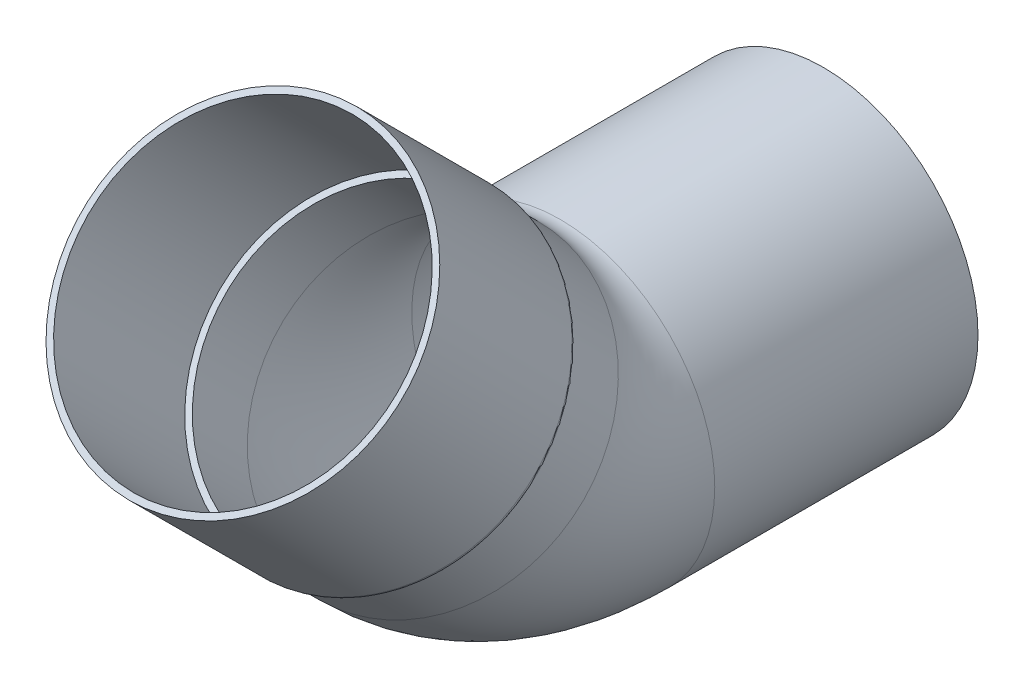
ISO-10303-21;
HEADER;
FILE_DESCRIPTION(('STEP AP214'),'2;1');
FILE_NAME('part.step','',(''),(''),'','','');
FILE_SCHEMA(('AUTOMOTIVE_DESIGN { 1 0 10303 214 1 1 1 1 }'));
ENDSEC;
DATA;
#1=APPLICATION_CONTEXT('core data for automotive mechanical design processes');
#2=APPLICATION_PROTOCOL_DEFINITION('international standard','automotive_design',2000,#1);
#3=PRODUCT_CONTEXT('',#1,'mechanical');
#4=PRODUCT('Part','Part','',(#3));
#5=PRODUCT_RELATED_PRODUCT_CATEGORY('part','',(#4));
#6=PRODUCT_DEFINITION_FORMATION('','',#4);
#7=PRODUCT_DEFINITION_CONTEXT('part definition',#1,'design');
#8=PRODUCT_DEFINITION('design','',#6,#7);
#9=PRODUCT_DEFINITION_SHAPE('','',#8);
#10=(LENGTH_UNIT() NAMED_UNIT(*) SI_UNIT(.MILLI.,.METRE.));
#11=(NAMED_UNIT(*) PLANE_ANGLE_UNIT() SI_UNIT($,.RADIAN.));
#12=(NAMED_UNIT(*) SI_UNIT($,.STERADIAN.) SOLID_ANGLE_UNIT());
#13=UNCERTAINTY_MEASURE_WITH_UNIT(LENGTH_MEASURE(1.E-05),#10,'distance_accuracy_value','');
#14=(GEOMETRIC_REPRESENTATION_CONTEXT(3) GLOBAL_UNCERTAINTY_ASSIGNED_CONTEXT((#13)) GLOBAL_UNIT_ASSIGNED_CONTEXT((#10,
#11,#12)) REPRESENTATION_CONTEXT('',''));
#15=CARTESIAN_POINT('',(0.,0.,0.));
#16=DIRECTION('',(0.,0.,1.));
#17=DIRECTION('',(1.,0.,0.));
#18=AXIS2_PLACEMENT_3D('',#15,#16,#17);
#19=CARTESIAN_POINT('',(0.,8.78679656440358,63.7867965644036));
#20=DIRECTION('',(0.,0.707106781186549,0.707106781186547));
#21=DIRECTION('',(0.,-0.707106781186547,0.707106781186549));
#22=AXIS2_PLACEMENT_3D('',#19,#20,#21);
#23=CYLINDRICAL_SURFACE('',#22,25.);
#24=CARTESIAN_POINT('',(0.,16.2634559672906,71.2634559672906));
#25=DIRECTION('',(0.,0.707106781186549,0.707106781186546));
#26=DIRECTION('',(0.,-0.707106781186546,0.707106781186549));
#27=AXIS2_PLACEMENT_3D('',#24,#25,#26);
#28=CIRCLE('',#27,25.);
#29=CARTESIAN_POINT('',(0.,-1.41421356237303,88.9411254969543));
#30=VERTEX_POINT('',#29);
#31=EDGE_CURVE('E54',#30,#30,#28,.F.);
#32=ORIENTED_EDGE('',*,*,#31,.T.);
#33=EDGE_LOOP('',(#32));
#34=FACE_BOUND('',#33,.T.);
#35=CARTESIAN_POINT('',(0.,8.78679656440358,63.7867965644036));
#36=DIRECTION('',(0.,0.707106781186548,0.707106781186547));
#37=DIRECTION('',(1.,0.,0.));
#38=AXIS2_PLACEMENT_3D('',#35,#36,#37);
#39=CIRCLE('',#38,25.);
#40=CARTESIAN_POINT('',(0.,-8.8908729652601,81.4644660940672));
#41=VERTEX_POINT('',#40);
#42=EDGE_CURVE('E63',#41,#41,#39,.T.);
#43=ORIENTED_EDGE('',*,*,#42,.T.);
#44=EDGE_LOOP('',(#43));
#45=FACE_BOUND('',#44,.T.);
#46=ADVANCED_FACE('F43',(#34,#45),#23,.T.);
#47=CARTESIAN_POINT('',(0.,30.,42.5735931288071));
#48=DIRECTION('',(-1.,0.,0.));
#49=DIRECTION('',(0.,0.,1.));
#50=AXIS2_PLACEMENT_3D('',#47,#48,#49);
#51=TOROIDAL_SURFACE('',#50,30.,25.);
#52=CARTESIAN_POINT('',(0.,0.,42.5735931288071));
#53=DIRECTION('',(0.,0.,1.));
#54=DIRECTION('',(1.,0.,0.));
#55=AXIS2_PLACEMENT_3D('',#52,#53,#54);
#56=CIRCLE('',#55,25.);
#57=CARTESIAN_POINT('',(0.,-25.,42.5735931288071));
#58=VERTEX_POINT('',#57);
#59=EDGE_CURVE('E66',#58,#58,#56,.T.);
#60=CARTESIAN_POINT('',(0.,30.,42.5735931288071));
#61=DIRECTION('',(-1.,0.,0.));
#62=DIRECTION('',(0.,0.,1.));
#63=AXIS2_PLACEMENT_3D('',#60,#61,#62);
#64=CIRCLE('',#63,55.);
#65=EDGE_CURVE('',#58,#41,#64,.T.);
#66=ORIENTED_EDGE('',*,*,#59,.T.);
#67=ORIENTED_EDGE('',*,*,#42,.F.);
#68=ORIENTED_EDGE('',*,*,#65,.T.);
#69=ORIENTED_EDGE('',*,*,#65,.F.);
#70=EDGE_LOOP('',(#66,#68,#67,#69));
#71=FACE_BOUND('',#70,.T.);
#72=ADVANCED_FACE('F109',(#71),#51,.T.);
#73=CARTESIAN_POINT('',(0.,0.,42.5735931288071));
#74=DIRECTION('',(0.,0.,-1.));
#75=DIRECTION('',(0.,1.,0.));
#76=AXIS2_PLACEMENT_3D('',#73,#74,#75);
#77=CYLINDRICAL_SURFACE('',#76,25.);
#78=ORIENTED_EDGE('',*,*,#59,.F.);
#79=EDGE_LOOP('',(#78));
#80=FACE_BOUND('',#79,.T.);
#81=CARTESIAN_POINT('',(0.,0.,0.));
#82=DIRECTION('',(0.,0.,1.));
#83=DIRECTION('',(1.,0.,0.));
#84=AXIS2_PLACEMENT_3D('',#81,#82,#83);
#85=CIRCLE('',#84,25.);
#86=CARTESIAN_POINT('',(25.,0.,0.));
#87=VERTEX_POINT('',#86);
#88=EDGE_CURVE('E67',#87,#87,#85,.T.);
#89=ORIENTED_EDGE('',*,*,#88,.T.);
#90=EDGE_LOOP('',(#89));
#91=FACE_BOUND('',#90,.T.);
#92=ADVANCED_FACE('F115',(#80,#91),#77,.T.);
#93=CARTESIAN_POINT('',(0.,0.,0.));
#94=DIRECTION('',(0.,0.,1.));
#95=DIRECTION('',(1.,0.,0.));
#96=AXIS2_PLACEMENT_3D('',#93,#94,#95);
#97=PLANE('',#96);
#98=CARTESIAN_POINT('',(0.,0.,0.));
#99=DIRECTION('',(0.,0.,1.));
#100=DIRECTION('',(1.,0.,0.));
#101=AXIS2_PLACEMENT_3D('',#98,#99,#100);
#102=CIRCLE('',#101,24.);
#103=CARTESIAN_POINT('',(24.,0.,0.));
#104=VERTEX_POINT('',#103);
#105=EDGE_CURVE('E73',#104,#104,#102,.T.);
#106=ORIENTED_EDGE('',*,*,#105,.T.);
#107=EDGE_LOOP('',(#106));
#108=FACE_BOUND('',#107,.T.);
#109=ORIENTED_EDGE('',*,*,#88,.F.);
#110=EDGE_LOOP('',(#109));
#111=FACE_BOUND('',#110,.T.);
#112=ADVANCED_FACE('F178',(#108,#111),#97,.F.);
#113=CARTESIAN_POINT('',(0.,8.78679656440358,63.7867965644036));
#114=DIRECTION('',(0.,0.707106781186549,0.707106781186547));
#115=DIRECTION('',(0.,-0.707106781186547,0.707106781186549));
#116=AXIS2_PLACEMENT_3D('',#113,#114,#115);
#117=CYLINDRICAL_SURFACE('',#116,24.);
#118=CARTESIAN_POINT('',(0.,8.78679656440358,63.7867965644036));
#119=DIRECTION('',(0.,0.707106781186549,0.707106781186547));
#120=DIRECTION('',(0.,-0.707106781186547,0.707106781186549));
#121=AXIS2_PLACEMENT_3D('',#118,#119,#120);
#122=CIRCLE('',#121,24.);
#123=CARTESIAN_POINT('',(0.,-8.18376618407354,80.7573593128807));
#124=VERTEX_POINT('',#123);
#125=EDGE_CURVE('E70',#124,#124,#122,.T.);
#126=ORIENTED_EDGE('',*,*,#125,.F.);
#127=EDGE_LOOP('',(#126));
#128=FACE_BOUND('',#127,.T.);
#129=CARTESIAN_POINT('',(0.,17.6776695296637,72.6776695296637));
#130=DIRECTION('',(0.,0.707106781186549,0.707106781186546));
#131=DIRECTION('',(0.,-0.707106781186546,0.707106781186549));
#132=AXIS2_PLACEMENT_3D('',#129,#130,#131);
#133=CIRCLE('',#132,24.);
#134=CARTESIAN_POINT('',(0.,0.707106781186614,89.6482322781408));
#135=VERTEX_POINT('',#134);
#136=EDGE_CURVE('E77',#135,#135,#133,.T.);
#137=ORIENTED_EDGE('',*,*,#136,.T.);
#138=EDGE_LOOP('',(#137));
#139=FACE_BOUND('',#138,.T.);
#140=ADVANCED_FACE('F173',(#128,#139),#117,.F.);
#141=CARTESIAN_POINT('',(0.,30.,42.5735931288071));
#142=DIRECTION('',(-1.,0.,0.));
#143=DIRECTION('',(0.,0.,1.));
#144=AXIS2_PLACEMENT_3D('',#141,#142,#143);
#145=TOROIDAL_SURFACE('',#144,30.,24.);
#146=CARTESIAN_POINT('',(0.,0.,42.5735931288071));
#147=DIRECTION('',(0.,0.,-1.));
#148=DIRECTION('',(0.,1.,0.));
#149=AXIS2_PLACEMENT_3D('',#146,#147,#148);
#150=CIRCLE('',#149,24.);
#151=CARTESIAN_POINT('',(0.,-24.,42.5735931288071));
#152=VERTEX_POINT('',#151);
#153=EDGE_CURVE('E76',#152,#152,#150,.F.);
#154=CARTESIAN_POINT('',(0.,30.,42.5735931288071));
#155=DIRECTION('',(-1.,0.,0.));
#156=DIRECTION('',(0.,0.,1.));
#157=AXIS2_PLACEMENT_3D('',#154,#155,#156);
#158=CIRCLE('',#157,54.);
#159=EDGE_CURVE('',#152,#124,#158,.T.);
#160=ORIENTED_EDGE('',*,*,#153,.F.);
#161=ORIENTED_EDGE('',*,*,#125,.T.);
#162=ORIENTED_EDGE('',*,*,#159,.T.);
#163=ORIENTED_EDGE('',*,*,#159,.F.);
#164=EDGE_LOOP('',(#160,#162,#161,#163));
#165=FACE_BOUND('',#164,.T.);
#166=ADVANCED_FACE('F177',(#165),#145,.F.);
#167=CARTESIAN_POINT('',(0.,0.,42.5735931288071));
#168=DIRECTION('',(0.,0.,-1.));
#169=DIRECTION('',(0.,1.,0.));
#170=AXIS2_PLACEMENT_3D('',#167,#168,#169);
#171=CYLINDRICAL_SURFACE('',#170,24.);
#172=ORIENTED_EDGE('',*,*,#153,.T.);
#173=EDGE_LOOP('',(#172));
#174=FACE_BOUND('',#173,.T.);
#175=ORIENTED_EDGE('',*,*,#105,.F.);
#176=EDGE_LOOP('',(#175));
#177=FACE_BOUND('',#176,.T.);
#178=ADVANCED_FACE('F166',(#174,#177),#171,.F.);
#179=CARTESIAN_POINT('',(0.,17.6776695296637,72.6776695296637));
#180=DIRECTION('',(0.,0.707106781186549,0.707106781186546));
#181=DIRECTION('',(0.,-0.707106781186546,0.707106781186549));
#182=AXIS2_PLACEMENT_3D('',#179,#180,#181);
#183=PLANE('',#182);
#184=CARTESIAN_POINT('',(0.,17.6776695296637,72.6776695296637));
#185=DIRECTION('',(0.,0.707106781186549,0.707106781186546));
#186=DIRECTION('',(0.,-0.707106781186546,0.707106781186549));
#187=AXIS2_PLACEMENT_3D('',#184,#185,#186);
#188=CIRCLE('',#187,25.);
#189=CARTESIAN_POINT('',(0.,0.,90.3553390593274));
#190=VERTEX_POINT('',#189);
#191=EDGE_CURVE('E58',#190,#190,#188,.F.);
#192=ORIENTED_EDGE('',*,*,#191,.F.);
#193=EDGE_LOOP('',(#192));
#194=FACE_BOUND('',#193,.T.);
#195=ORIENTED_EDGE('',*,*,#136,.F.);
#196=EDGE_LOOP('',(#195));
#197=FACE_BOUND('',#196,.T.);
#198=ADVANCED_FACE('F105',(#194,#197),#183,.T.);
#199=CARTESIAN_POINT('',(0.,17.6776695296637,72.6776695296637));
#200=DIRECTION('',(0.,-0.707106781186549,-0.707106781186546));
#201=DIRECTION('',(0.,0.707106781186546,-0.707106781186549));
#202=AXIS2_PLACEMENT_3D('',#199,#200,#201);
#203=CYLINDRICAL_SURFACE('',#202,26.);
#204=CARTESIAN_POINT('',(0.,17.4882008386825,72.4882008386825));
#205=DIRECTION('',(0.,-0.707106781186549,-0.707106781186546));
#206=DIRECTION('',(0.,0.707106781186546,-0.707106781186549));
#207=AXIS2_PLACEMENT_3D('',#204,#205,#206);
#208=CIRCLE('',#207,26.);
#209=CARTESIAN_POINT('',(0.,35.8729771495327,54.1034245278322));
#210=VERTEX_POINT('',#209);
#211=EDGE_CURVE('E50',#210,#210,#208,.F.);
#212=ORIENTED_EDGE('',*,*,#211,.T.);
#213=EDGE_LOOP('',(#212));
#214=FACE_BOUND('',#213,.T.);
#215=CARTESIAN_POINT('',(0.,38.8908729652602,93.8908729652601));
#216=DIRECTION('',(0.,0.707106781186549,0.707106781186546));
#217=DIRECTION('',(0.,-0.707106781186546,0.707106781186549));
#218=AXIS2_PLACEMENT_3D('',#215,#216,#217);
#219=CIRCLE('',#218,26.);
#220=CARTESIAN_POINT('',(0.,20.50609665441,112.27564927611));
#221=VERTEX_POINT('',#220);
#222=EDGE_CURVE('E84',#221,#221,#219,.T.);
#223=ORIENTED_EDGE('',*,*,#222,.F.);
#224=EDGE_LOOP('',(#223));
#225=FACE_BOUND('',#224,.T.);
#226=ADVANCED_FACE('F96',(#214,#225),#203,.T.);
#227=CARTESIAN_POINT('',(0.,38.8908729652602,93.8908729652601));
#228=DIRECTION('',(0.,0.707106781186549,0.707106781186546));
#229=DIRECTION('',(0.,-0.707106781186546,0.707106781186549));
#230=AXIS2_PLACEMENT_3D('',#227,#228,#229);
#231=PLANE('',#230);
#232=ORIENTED_EDGE('',*,*,#222,.T.);
#233=EDGE_LOOP('',(#232));
#234=FACE_BOUND('',#233,.T.);
#235=CARTESIAN_POINT('',(0.,38.8908729652602,93.8908729652601));
#236=DIRECTION('',(0.,0.707106781186549,0.707106781186546));
#237=DIRECTION('',(1.,0.,0.));
#238=AXIS2_PLACEMENT_3D('',#235,#236,#237);
#239=CIRCLE('',#238,25.);
#240=CARTESIAN_POINT('',(25.,38.8908729652602,93.8908729652601));
#241=VERTEX_POINT('',#240);
#242=EDGE_CURVE('E87',#241,#241,#239,.T.);
#243=ORIENTED_EDGE('',*,*,#242,.F.);
#244=EDGE_LOOP('',(#243));
#245=FACE_BOUND('',#244,.T.);
#246=ADVANCED_FACE('F94',(#234,#245),#231,.T.);
#247=CARTESIAN_POINT('',(0.,38.8908729652602,93.8908729652601));
#248=DIRECTION('',(0.,-0.707106781186549,-0.707106781186546));
#249=DIRECTION('',(0.,0.707106781186546,-0.707106781186549));
#250=AXIS2_PLACEMENT_3D('',#247,#248,#249);
#251=CYLINDRICAL_SURFACE('',#250,25.);
#252=ORIENTED_EDGE('',*,*,#242,.T.);
#253=EDGE_LOOP('',(#252));
#254=FACE_BOUND('',#253,.T.);
#255=ORIENTED_EDGE('',*,*,#191,.T.);
#256=EDGE_LOOP('',(#255));
#257=FACE_BOUND('',#256,.T.);
#258=ADVANCED_FACE('F91',(#254,#257),#251,.F.);
#259=CARTESIAN_POINT('',(0.,16.2634559672906,71.2634559672906));
#260=DIRECTION('',(0.,0.707106781186549,0.707106781186546));
#261=DIRECTION('',(0.,-0.707106781186546,0.707106781186549));
#262=AXIS2_PLACEMENT_3D('',#259,#260,#261);
#263=TOROIDAL_SURFACE('',#262,26.,1.);
#264=CARTESIAN_POINT('',(0.,16.8758284029863,71.8758284029863));
#265=DIRECTION('',(0.,-0.707106781186549,-0.707106781186546));
#266=DIRECTION('',(0.,0.707106781186546,-0.707106781186549));
#267=AXIS2_PLACEMENT_3D('',#264,#265,#266);
#268=CIRCLE('',#267,25.5000000000003);
#269=CARTESIAN_POINT('',(0.,34.9070513232435,53.8446054827291));
#270=VERTEX_POINT('',#269);
#271=EDGE_CURVE('E11',#270,#270,#268,.T.);
#272=ORIENTED_EDGE('',*,*,#271,.T.);
#273=EDGE_LOOP('',(#272));
#274=FACE_BOUND('',#273,.T.);
#275=ORIENTED_EDGE('',*,*,#31,.F.);
#276=EDGE_LOOP('',(#275));
#277=FACE_BOUND('',#276,.T.);
#278=ADVANCED_FACE('F103',(#274,#277),#263,.F.);
#279=CARTESIAN_POINT('',(0.,17.4882008386825,72.4882008386825));
#280=DIRECTION('',(0.,-0.707106781186549,-0.707106781186546));
#281=DIRECTION('',(0.,0.707106781186546,-0.707106781186549));
#282=AXIS2_PLACEMENT_3D('',#279,#280,#281);
#283=TOROIDAL_SURFACE('',#282,25.0000000000002,1.);
#284=ORIENTED_EDGE('',*,*,#271,.F.);
#285=EDGE_LOOP('',(#284));
#286=FACE_BOUND('',#285,.T.);
#287=ORIENTED_EDGE('',*,*,#211,.F.);
#288=EDGE_LOOP('',(#287));
#289=FACE_BOUND('',#288,.T.);
#290=ADVANCED_FACE('F45',(#286,#289),#283,.T.);
#291=CLOSED_SHELL('',(#46,#72,#92,#112,#140,#166,#178,#198,#226,#246,#258,#278,#290));
#292=MANIFOLD_SOLID_BREP('B2',#291);
#293=ADVANCED_BREP_SHAPE_REPRESENTATION('',(#18,#292),#14);
#294=SHAPE_DEFINITION_REPRESENTATION(#9,#293);
ENDSEC;
END-ISO-10303-21;
